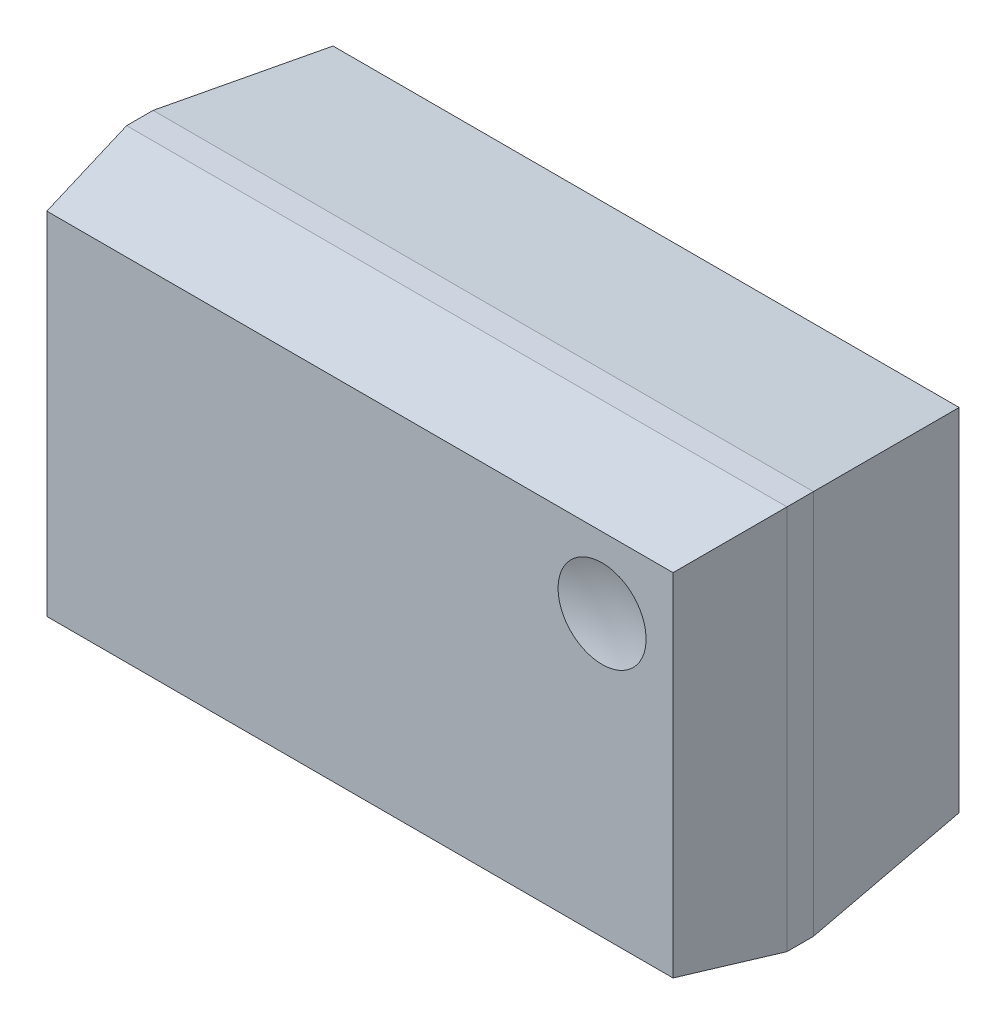
ISO-10303-21;
HEADER;
FILE_DESCRIPTION(('STEP AP214'),'2;1');
FILE_NAME('part.step','',(''),(''),'','','');
FILE_SCHEMA(('AUTOMOTIVE_DESIGN { 1 0 10303 214 1 1 1 1 }'));
ENDSEC;
DATA;
#1=APPLICATION_CONTEXT('core data for automotive mechanical design processes');
#2=APPLICATION_PROTOCOL_DEFINITION('international standard','automotive_design',2000,#1);
#3=PRODUCT_CONTEXT('',#1,'mechanical');
#4=PRODUCT('Part','Part','',(#3));
#5=PRODUCT_RELATED_PRODUCT_CATEGORY('part','',(#4));
#6=PRODUCT_DEFINITION_FORMATION('','',#4);
#7=PRODUCT_DEFINITION_CONTEXT('part definition',#1,'design');
#8=PRODUCT_DEFINITION('design','',#6,#7);
#9=PRODUCT_DEFINITION_SHAPE('','',#8);
#10=(LENGTH_UNIT() NAMED_UNIT(*) SI_UNIT(.MILLI.,.METRE.));
#11=(NAMED_UNIT(*) PLANE_ANGLE_UNIT() SI_UNIT($,.RADIAN.));
#12=(NAMED_UNIT(*) SI_UNIT($,.STERADIAN.) SOLID_ANGLE_UNIT());
#13=UNCERTAINTY_MEASURE_WITH_UNIT(LENGTH_MEASURE(1.E-05),#10,'distance_accuracy_value','');
#14=(GEOMETRIC_REPRESENTATION_CONTEXT(3) GLOBAL_UNCERTAINTY_ASSIGNED_CONTEXT((#13)) GLOBAL_UNIT_ASSIGNED_CONTEXT((#10,
#11,#12)) REPRESENTATION_CONTEXT('',''));
#15=CARTESIAN_POINT('',(0.,0.,0.));
#16=DIRECTION('',(0.,0.,1.));
#17=DIRECTION('',(1.,0.,0.));
#18=AXIS2_PLACEMENT_3D('',#15,#16,#17);
#19=CARTESIAN_POINT('',(1.5,0.875,-0.0599999999999755));
#20=DIRECTION('',(0.994521895368274,0.,-0.10452846326765));
#21=DIRECTION('',(-0.10452846326765,0.,-0.994521895368274));
#22=AXIS2_PLACEMENT_3D('',#19,#20,#21);
#23=PLANE('',#22);
#24=DIRECTION('',(0.103962051184495,0.103962051184495,0.989132844377854));
#25=VECTOR('',#24,1.);
#26=CARTESIAN_POINT('',(1.4222228659034,0.797222865903399,-0.8));
#27=LINE('',#26,#25);
#28=CARTESIAN_POINT('',(1.4222228659034,0.797222865903399,-0.8));
#29=VERTEX_POINT('',#28);
#30=CARTESIAN_POINT('',(1.5,0.875,-0.0599999999999756));
#31=VERTEX_POINT('',#30);
#32=EDGE_CURVE('E102',#29,#31,#27,.T.);
#33=ORIENTED_EDGE('',*,*,#32,.T.);
#34=DIRECTION('',(0.,1.,0.));
#35=VECTOR('',#34,1.);
#36=CARTESIAN_POINT('',(1.5,0.875,-0.0599999999999755));
#37=LINE('',#36,#35);
#38=CARTESIAN_POINT('',(1.5,-0.875,-0.0599999999999755));
#39=VERTEX_POINT('',#38);
#40=EDGE_CURVE('E89',#39,#31,#37,.T.);
#41=ORIENTED_EDGE('',*,*,#40,.F.);
#42=DIRECTION('',(-0.103962051184495,0.103962051184495,-0.989132844377854));
#43=VECTOR('',#42,1.);
#44=CARTESIAN_POINT('',(1.5,-0.875000000000001,-0.0599999999999755));
#45=LINE('',#44,#43);
#46=CARTESIAN_POINT('',(1.4222228659034,-0.7972228659034,-0.8));
#47=VERTEX_POINT('',#46);
#48=EDGE_CURVE('E86',#39,#47,#45,.T.);
#49=ORIENTED_EDGE('',*,*,#48,.T.);
#50=DIRECTION('',(0.,1.,0.));
#51=VECTOR('',#50,1.);
#52=CARTESIAN_POINT('',(1.4222228659034,0.875,-0.8));
#53=LINE('',#52,#51);
#54=EDGE_CURVE('E82',#47,#29,#53,.T.);
#55=ORIENTED_EDGE('',*,*,#54,.T.);
#56=EDGE_LOOP('',(#33,#41,#49,#55));
#57=FACE_BOUND('',#56,.T.);
#58=ADVANCED_FACE('F16',(#57),#23,.T.);
#59=CARTESIAN_POINT('',(-1.5,0.875,-0.0599999999999755));
#60=DIRECTION('',(-0.994521895368274,0.,-0.10452846326765));
#61=DIRECTION('',(-0.10452846326765,0.,0.994521895368274));
#62=AXIS2_PLACEMENT_3D('',#59,#60,#61);
#63=PLANE('',#62);
#64=DIRECTION('',(-0.103962051184495,-0.103962051184495,0.989132844377854));
#65=VECTOR('',#64,1.);
#66=CARTESIAN_POINT('',(-1.4222228659034,-0.7972228659034,-0.8));
#67=LINE('',#66,#65);
#68=CARTESIAN_POINT('',(-1.4222228659034,-0.7972228659034,-0.8));
#69=VERTEX_POINT('',#68);
#70=CARTESIAN_POINT('',(-1.5,-0.875000000000001,-0.0599999999999756));
#71=VERTEX_POINT('',#70);
#72=EDGE_CURVE('E95',#69,#71,#67,.T.);
#73=ORIENTED_EDGE('',*,*,#72,.T.);
#74=DIRECTION('',(0.,1.,0.));
#75=VECTOR('',#74,1.);
#76=CARTESIAN_POINT('',(-1.5,0.875,-0.0599999999999755));
#77=LINE('',#76,#75);
#78=CARTESIAN_POINT('',(-1.5,0.875,-0.0599999999999756));
#79=VERTEX_POINT('',#78);
#80=EDGE_CURVE('E118',#79,#71,#77,.F.);
#81=ORIENTED_EDGE('',*,*,#80,.F.);
#82=DIRECTION('',(0.103962051184495,-0.103962051184495,-0.989132844377854));
#83=VECTOR('',#82,1.);
#84=CARTESIAN_POINT('',(-1.5,0.875,-0.0599999999999755));
#85=LINE('',#84,#83);
#86=CARTESIAN_POINT('',(-1.4222228659034,0.797222865903399,-0.8));
#87=VERTEX_POINT('',#86);
#88=EDGE_CURVE('E104',#79,#87,#85,.T.);
#89=ORIENTED_EDGE('',*,*,#88,.T.);
#90=DIRECTION('',(0.,1.,0.));
#91=VECTOR('',#90,1.);
#92=CARTESIAN_POINT('',(-1.4222228659034,0.875,-0.8));
#93=LINE('',#92,#91);
#94=EDGE_CURVE('E108',#87,#69,#93,.F.);
#95=ORIENTED_EDGE('',*,*,#94,.T.);
#96=EDGE_LOOP('',(#73,#81,#89,#95));
#97=FACE_BOUND('',#96,.T.);
#98=ADVANCED_FACE('F141',(#97),#63,.T.);
#99=CARTESIAN_POINT('',(1.5,0.875,-0.8));
#100=DIRECTION('',(1.,0.,0.));
#101=DIRECTION('',(0.,0.,-1.));
#102=AXIS2_PLACEMENT_3D('',#99,#100,#101);
#103=PLANE('',#102);
#104=DIRECTION('',(0.,0.,-1.));
#105=VECTOR('',#104,1.);
#106=CARTESIAN_POINT('',(1.5,0.875,-0.8));
#107=LINE('',#106,#105);
#108=CARTESIAN_POINT('',(1.5,0.875,0.0599999999999915));
#109=VERTEX_POINT('',#108);
#110=EDGE_CURVE('E114',#31,#109,#107,.F.);
#111=ORIENTED_EDGE('',*,*,#110,.T.);
#112=DIRECTION('',(0.,1.,0.));
#113=VECTOR('',#112,1.);
#114=CARTESIAN_POINT('',(1.5,-0.875,0.0599999999999914));
#115=LINE('',#114,#113);
#116=CARTESIAN_POINT('',(1.5,-0.875,0.0599999999999915));
#117=VERTEX_POINT('',#116);
#118=EDGE_CURVE('E201',#109,#117,#115,.F.);
#119=ORIENTED_EDGE('',*,*,#118,.T.);
#120=DIRECTION('',(0.,0.,-1.));
#121=VECTOR('',#120,1.);
#122=CARTESIAN_POINT('',(1.5,-0.875,-0.8));
#123=LINE('',#122,#121);
#124=EDGE_CURVE('E111',#117,#39,#123,.T.);
#125=ORIENTED_EDGE('',*,*,#124,.T.);
#126=ORIENTED_EDGE('',*,*,#40,.T.);
#127=EDGE_LOOP('',(#111,#119,#125,#126));
#128=FACE_BOUND('',#127,.T.);
#129=ADVANCED_FACE('F138',(#128),#103,.T.);
#130=CARTESIAN_POINT('',(-1.5,0.875,-0.8));
#131=DIRECTION('',(-1.,0.,0.));
#132=DIRECTION('',(0.,0.,1.));
#133=AXIS2_PLACEMENT_3D('',#130,#131,#132);
#134=PLANE('',#133);
#135=DIRECTION('',(0.,0.,1.));
#136=VECTOR('',#135,1.);
#137=CARTESIAN_POINT('',(-1.5,-0.875,-0.8));
#138=LINE('',#137,#136);
#139=CARTESIAN_POINT('',(-1.5,-0.875,0.0599999999999916));
#140=VERTEX_POINT('',#139);
#141=EDGE_CURVE('E121',#71,#140,#138,.T.);
#142=ORIENTED_EDGE('',*,*,#141,.T.);
#143=DIRECTION('',(0.,1.,0.));
#144=VECTOR('',#143,1.);
#145=CARTESIAN_POINT('',(-1.5,-0.875,0.0599999999999915));
#146=LINE('',#145,#144);
#147=CARTESIAN_POINT('',(-1.5,0.875,0.0599999999999916));
#148=VERTEX_POINT('',#147);
#149=EDGE_CURVE('E187',#140,#148,#146,.T.);
#150=ORIENTED_EDGE('',*,*,#149,.T.);
#151=DIRECTION('',(0.,0.,1.));
#152=VECTOR('',#151,1.);
#153=CARTESIAN_POINT('',(-1.5,0.875,-0.8));
#154=LINE('',#153,#152);
#155=EDGE_CURVE('E116',#148,#79,#154,.F.);
#156=ORIENTED_EDGE('',*,*,#155,.T.);
#157=ORIENTED_EDGE('',*,*,#80,.T.);
#158=EDGE_LOOP('',(#142,#150,#156,#157));
#159=FACE_BOUND('',#158,.T.);
#160=ADVANCED_FACE('F133',(#159),#134,.T.);
#161=CARTESIAN_POINT('',(1.09679939024296,0.475,1.1305));
#162=DIRECTION('',(0.,1.,0.));
#163=DIRECTION('',(-1.,0.,0.));
#164=AXIS2_PLACEMENT_3D('',#161,#162,#163);
#165=CIRCLE('',#164,0.6605);
#166=TRIMMED_CURVE('',#165,(PARAMETER_VALUE(-1.57564208346841)),
(PARAMETER_VALUE(1.57564208346841)),.T.,.PARAMETER.);
#167=CARTESIAN_POINT('',(1.1,0.475,1.1305));
#168=DIRECTION('',(0.,0.,-1.));
#169=AXIS1_PLACEMENT('',#167,#168);
#170=SURFACE_OF_REVOLUTION('',#166,#169);
#171=CARTESIAN_POINT('',(1.1,0.475,0.5));
#172=DIRECTION('',(0.,0.,-1.));
#173=DIRECTION('',(-1.,0.,0.));
#174=AXIS2_PLACEMENT_3D('',#171,#172,#173);
#175=CIRCLE('',#174,0.199999999999999);
#176=CARTESIAN_POINT('',(0.900000000000001,0.475,0.5));
#177=VERTEX_POINT('',#176);
#178=EDGE_CURVE('E19',#177,#177,#175,.T.);
#179=ORIENTED_EDGE('',*,*,#178,.F.);
#180=EDGE_LOOP('',(#179));
#181=FACE_BOUND('',#180,.T.);
#182=CARTESIAN_POINT('',(1.1,0.475,0.47));
#183=VERTEX_POINT('',#182);
#184=VERTEX_LOOP('',#183);
#185=FACE_BOUND('',#184,.T.);
#186=ADVANCED_FACE('F128',(#181,#185),#170,.T.);
#187=CARTESIAN_POINT('',(1.42241612848828,-0.875,0.5));
#188=DIRECTION('',(-0.984807753012209,0.,-0.173648177666927));
#189=DIRECTION('',(-0.173648177666927,0.,0.984807753012209));
#190=AXIS2_PLACEMENT_3D('',#187,#188,#189);
#191=PLANE('',#190);
#192=ORIENTED_EDGE('',*,*,#118,.F.);
#193=DIRECTION('',(0.171087869746033,0.171087869746033,-0.970287525247815));
#194=VECTOR('',#193,1.);
#195=CARTESIAN_POINT('',(1.42241612848828,0.797416128488276,0.5));
#196=LINE('',#195,#194);
#197=CARTESIAN_POINT('',(1.42241612848828,0.797416128488275,0.5));
#198=VERTEX_POINT('',#197);
#199=EDGE_CURVE('E123',#198,#109,#196,.T.);
#200=ORIENTED_EDGE('',*,*,#199,.F.);
#201=DIRECTION('',(0.,1.,0.));
#202=VECTOR('',#201,1.);
#203=CARTESIAN_POINT('',(1.42241612848828,-0.875,0.5));
#204=LINE('',#203,#202);
#205=CARTESIAN_POINT('',(1.42241612848828,-0.797416128488275,0.5));
#206=VERTEX_POINT('',#205);
#207=EDGE_CURVE('E213',#206,#198,#204,.T.);
#208=ORIENTED_EDGE('',*,*,#207,.F.);
#209=DIRECTION('',(-0.171087869746033,0.171087869746033,0.970287525247815));
#210=VECTOR('',#209,1.);
#211=CARTESIAN_POINT('',(1.5,-0.875,0.0599999999999915));
#212=LINE('',#211,#210);
#213=EDGE_CURVE('E199',#117,#206,#212,.T.);
#214=ORIENTED_EDGE('',*,*,#213,.F.);
#215=EDGE_LOOP('',(#192,#200,#208,#214));
#216=FACE_BOUND('',#215,.T.);
#217=ADVANCED_FACE('F132',(#216),#191,.F.);
#218=CARTESIAN_POINT('',(-1.42241612848828,-0.875,0.5));
#219=DIRECTION('',(0.984807753012209,0.,-0.173648177666927));
#220=DIRECTION('',(-0.173648177666927,0.,-0.984807753012209));
#221=AXIS2_PLACEMENT_3D('',#218,#219,#220);
#222=PLANE('',#221);
#223=ORIENTED_EDGE('',*,*,#149,.F.);
#224=DIRECTION('',(-0.171087869746033,-0.171087869746033,-0.970287525247815));
#225=VECTOR('',#224,1.);
#226=CARTESIAN_POINT('',(-1.42241612848828,-0.797416128488275,0.5));
#227=LINE('',#226,#225);
#228=CARTESIAN_POINT('',(-1.42241612848828,-0.797416128488275,0.5));
#229=VERTEX_POINT('',#228);
#230=EDGE_CURVE('E189',#229,#140,#227,.T.);
#231=ORIENTED_EDGE('',*,*,#230,.F.);
#232=DIRECTION('',(0.,1.,0.));
#233=VECTOR('',#232,1.);
#234=CARTESIAN_POINT('',(-1.42241612848828,-0.875,0.5));
#235=LINE('',#234,#233);
#236=CARTESIAN_POINT('',(-1.42241612848828,0.797416128488275,0.5));
#237=VERTEX_POINT('',#236);
#238=EDGE_CURVE('E215',#237,#229,#235,.F.);
#239=ORIENTED_EDGE('',*,*,#238,.F.);
#240=DIRECTION('',(0.171087869746033,-0.171087869746033,0.970287525247815));
#241=VECTOR('',#240,1.);
#242=CARTESIAN_POINT('',(-1.5,0.875000000000001,0.0599999999999915));
#243=LINE('',#242,#241);
#244=EDGE_CURVE('E34',#148,#237,#243,.T.);
#245=ORIENTED_EDGE('',*,*,#244,.F.);
#246=EDGE_LOOP('',(#223,#231,#239,#245));
#247=FACE_BOUND('',#246,.T.);
#248=ADVANCED_FACE('F177',(#247),#222,.F.);
#249=CARTESIAN_POINT('',(-1.5,-0.875,0.5));
#250=DIRECTION('',(0.,0.,1.));
#251=DIRECTION('',(1.,0.,0.));
#252=AXIS2_PLACEMENT_3D('',#249,#250,#251);
#253=PLANE('',#252);
#254=DIRECTION('',(1.,0.,0.));
#255=VECTOR('',#254,1.);
#256=CARTESIAN_POINT('',(-1.5,0.797416128488275,0.5));
#257=LINE('',#256,#255);
#258=EDGE_CURVE('E209',#198,#237,#257,.F.);
#259=ORIENTED_EDGE('',*,*,#258,.T.);
#260=ORIENTED_EDGE('',*,*,#238,.T.);
#261=DIRECTION('',(1.,0.,0.));
#262=VECTOR('',#261,1.);
#263=CARTESIAN_POINT('',(-1.5,-0.797416128488275,0.5));
#264=LINE('',#263,#262);
#265=EDGE_CURVE('E198',#229,#206,#264,.T.);
#266=ORIENTED_EDGE('',*,*,#265,.T.);
#267=ORIENTED_EDGE('',*,*,#207,.T.);
#268=EDGE_LOOP('',(#259,#260,#266,#267));
#269=FACE_BOUND('',#268,.T.);
#270=ORIENTED_EDGE('',*,*,#178,.T.);
#271=EDGE_LOOP('',(#270));
#272=FACE_BOUND('',#271,.T.);
#273=ADVANCED_FACE('F174',(#269,#272),#253,.T.);
#274=CARTESIAN_POINT('',(-1.5,-0.797416128488275,0.5));
#275=DIRECTION('',(0.,0.984807753012209,-0.173648177666928));
#276=DIRECTION('',(0.,0.173648177666928,0.984807753012209));
#277=AXIS2_PLACEMENT_3D('',#274,#275,#276);
#278=PLANE('',#277);
#279=DIRECTION('',(1.,0.,0.));
#280=VECTOR('',#279,1.);
#281=CARTESIAN_POINT('',(-1.5,-0.875,0.0599999999999916));
#282=LINE('',#281,#280);
#283=EDGE_CURVE('E195',#117,#140,#282,.F.);
#284=ORIENTED_EDGE('',*,*,#283,.F.);
#285=ORIENTED_EDGE('',*,*,#213,.T.);
#286=ORIENTED_EDGE('',*,*,#265,.F.);
#287=ORIENTED_EDGE('',*,*,#230,.T.);
#288=EDGE_LOOP('',(#284,#285,#286,#287));
#289=FACE_BOUND('',#288,.T.);
#290=ADVANCED_FACE('F171',(#289),#278,.F.);
#291=CARTESIAN_POINT('',(-1.5,0.797416128488275,0.5));
#292=DIRECTION('',(0.,-0.984807753012208,-0.173648177666928));
#293=DIRECTION('',(0.,0.173648177666928,-0.984807753012208));
#294=AXIS2_PLACEMENT_3D('',#291,#292,#293);
#295=PLANE('',#294);
#296=ORIENTED_EDGE('',*,*,#258,.F.);
#297=ORIENTED_EDGE('',*,*,#199,.T.);
#298=DIRECTION('',(1.,0.,0.));
#299=VECTOR('',#298,1.);
#300=CARTESIAN_POINT('',(-1.5,0.875,0.0599999999999916));
#301=LINE('',#300,#299);
#302=EDGE_CURVE('E207',#148,#109,#301,.T.);
#303=ORIENTED_EDGE('',*,*,#302,.F.);
#304=ORIENTED_EDGE('',*,*,#244,.T.);
#305=EDGE_LOOP('',(#296,#297,#303,#304));
#306=FACE_BOUND('',#305,.T.);
#307=ADVANCED_FACE('F167',(#306),#295,.F.);
#308=CARTESIAN_POINT('',(-1.5,-0.875,-0.8));
#309=DIRECTION('',(0.,-1.,0.));
#310=DIRECTION('',(0.,0.,-1.));
#311=AXIS2_PLACEMENT_3D('',#308,#309,#310);
#312=PLANE('',#311);
#313=ORIENTED_EDGE('',*,*,#124,.F.);
#314=ORIENTED_EDGE('',*,*,#283,.T.);
#315=ORIENTED_EDGE('',*,*,#141,.F.);
#316=DIRECTION('',(1.,0.,0.));
#317=VECTOR('',#316,1.);
#318=CARTESIAN_POINT('',(-1.5,-0.875,-0.0599999999999755));
#319=LINE('',#318,#317);
#320=EDGE_CURVE('E224',#39,#71,#319,.F.);
#321=ORIENTED_EDGE('',*,*,#320,.F.);
#322=EDGE_LOOP('',(#313,#314,#315,#321));
#323=FACE_BOUND('',#322,.T.);
#324=ADVANCED_FACE('F163',(#323),#312,.T.);
#325=CARTESIAN_POINT('',(-1.5,0.875,-0.8));
#326=DIRECTION('',(0.,1.,0.));
#327=DIRECTION('',(0.,0.,1.));
#328=AXIS2_PLACEMENT_3D('',#325,#326,#327);
#329=PLANE('',#328);
#330=ORIENTED_EDGE('',*,*,#155,.F.);
#331=ORIENTED_EDGE('',*,*,#302,.T.);
#332=ORIENTED_EDGE('',*,*,#110,.F.);
#333=DIRECTION('',(1.,0.,0.));
#334=VECTOR('',#333,1.);
#335=CARTESIAN_POINT('',(-1.5,0.875,-0.0599999999999755));
#336=LINE('',#335,#334);
#337=EDGE_CURVE('E98',#79,#31,#336,.T.);
#338=ORIENTED_EDGE('',*,*,#337,.F.);
#339=EDGE_LOOP('',(#330,#331,#332,#338));
#340=FACE_BOUND('',#339,.T.);
#341=ADVANCED_FACE('F160',(#340),#329,.T.);
#342=CARTESIAN_POINT('',(-1.5,-0.875,-0.0599999999999755));
#343=DIRECTION('',(0.,-0.994521895368274,-0.10452846326765));
#344=DIRECTION('',(0.,0.10452846326765,-0.994521895368274));
#345=AXIS2_PLACEMENT_3D('',#342,#343,#344);
#346=PLANE('',#345);
#347=ORIENTED_EDGE('',*,*,#48,.F.);
#348=ORIENTED_EDGE('',*,*,#320,.T.);
#349=ORIENTED_EDGE('',*,*,#72,.F.);
#350=DIRECTION('',(1.,0.,0.));
#351=VECTOR('',#350,1.);
#352=CARTESIAN_POINT('',(-1.5,-0.797222865903399,-0.8));
#353=LINE('',#352,#351);
#354=EDGE_CURVE('E25',#69,#47,#353,.T.);
#355=ORIENTED_EDGE('',*,*,#354,.T.);
#356=EDGE_LOOP('',(#347,#348,#349,#355));
#357=FACE_BOUND('',#356,.T.);
#358=ADVANCED_FACE('F94',(#357),#346,.T.);
#359=CARTESIAN_POINT('',(-1.5,0.875,-0.0599999999999755));
#360=DIRECTION('',(0.,0.994521895368274,-0.10452846326765));
#361=DIRECTION('',(0.,0.10452846326765,0.994521895368274));
#362=AXIS2_PLACEMENT_3D('',#359,#360,#361);
#363=PLANE('',#362);
#364=ORIENTED_EDGE('',*,*,#32,.F.);
#365=DIRECTION('',(1.,0.,0.));
#366=VECTOR('',#365,1.);
#367=CARTESIAN_POINT('',(-1.5,0.797222865903399,-0.8));
#368=LINE('',#367,#366);
#369=EDGE_CURVE('E10',#29,#87,#368,.F.);
#370=ORIENTED_EDGE('',*,*,#369,.T.);
#371=ORIENTED_EDGE('',*,*,#88,.F.);
#372=ORIENTED_EDGE('',*,*,#337,.T.);
#373=EDGE_LOOP('',(#364,#370,#371,#372));
#374=FACE_BOUND('',#373,.T.);
#375=ADVANCED_FACE('F150',(#374),#363,.T.);
#376=CARTESIAN_POINT('',(-1.5,-0.875,-0.8));
#377=DIRECTION('',(0.,0.,1.));
#378=DIRECTION('',(1.,0.,0.));
#379=AXIS2_PLACEMENT_3D('',#376,#377,#378);
#380=PLANE('',#379);
#381=ORIENTED_EDGE('',*,*,#54,.F.);
#382=ORIENTED_EDGE('',*,*,#354,.F.);
#383=ORIENTED_EDGE('',*,*,#94,.F.);
#384=ORIENTED_EDGE('',*,*,#369,.F.);
#385=EDGE_LOOP('',(#381,#382,#383,#384));
#386=FACE_BOUND('',#385,.T.);
#387=ADVANCED_FACE('F100',(#386),#380,.F.);
#388=CLOSED_SHELL('',(#58,#98,#129,#160,#186,#217,#248,#273,#290,#307,#324,#341,#358,#375,#387));
#389=MANIFOLD_SOLID_BREP('B1',#388);
#390=ADVANCED_BREP_SHAPE_REPRESENTATION('',(#18,#389),#14);
#391=SHAPE_DEFINITION_REPRESENTATION(#9,#390);
ENDSEC;
END-ISO-10303-21;
